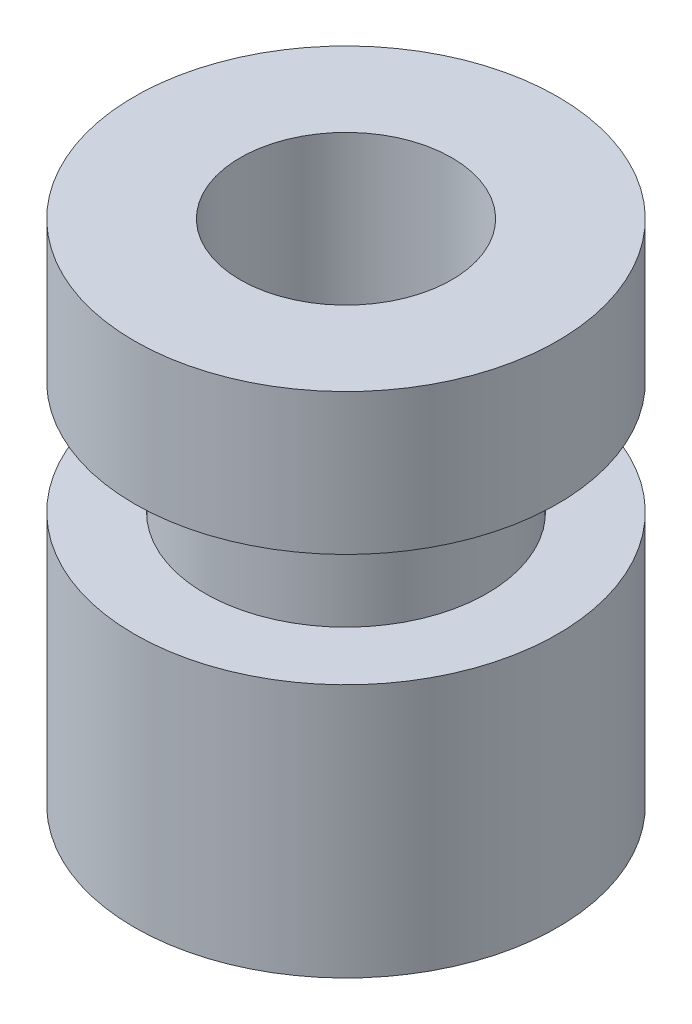
ISO-10303-21;
HEADER;
FILE_DESCRIPTION(('STEP AP214'),'2;1');
FILE_NAME('part.step','',(''),(''),'','','');
FILE_SCHEMA(('AUTOMOTIVE_DESIGN { 1 0 10303 214 1 1 1 1 }'));
ENDSEC;
DATA;
#1=APPLICATION_CONTEXT('core data for automotive mechanical design processes');
#2=APPLICATION_PROTOCOL_DEFINITION('international standard','automotive_design',2000,#1);
#3=PRODUCT_CONTEXT('',#1,'mechanical');
#4=PRODUCT('Part','Part','',(#3));
#5=PRODUCT_RELATED_PRODUCT_CATEGORY('part','',(#4));
#6=PRODUCT_DEFINITION_FORMATION('','',#4);
#7=PRODUCT_DEFINITION_CONTEXT('part definition',#1,'design');
#8=PRODUCT_DEFINITION('design','',#6,#7);
#9=PRODUCT_DEFINITION_SHAPE('','',#8);
#10=(LENGTH_UNIT() NAMED_UNIT(*) SI_UNIT(.MILLI.,.METRE.));
#11=(NAMED_UNIT(*) PLANE_ANGLE_UNIT() SI_UNIT($,.RADIAN.));
#12=(NAMED_UNIT(*) SI_UNIT($,.STERADIAN.) SOLID_ANGLE_UNIT());
#13=UNCERTAINTY_MEASURE_WITH_UNIT(LENGTH_MEASURE(1.E-05),#10,'distance_accuracy_value','');
#14=(GEOMETRIC_REPRESENTATION_CONTEXT(3) GLOBAL_UNCERTAINTY_ASSIGNED_CONTEXT((#13)) GLOBAL_UNIT_ASSIGNED_CONTEXT((#10,
#11,#12)) REPRESENTATION_CONTEXT('',''));
#15=CARTESIAN_POINT('',(0.,0.,0.));
#16=DIRECTION('',(0.,0.,1.));
#17=DIRECTION('',(1.,0.,0.));
#18=AXIS2_PLACEMENT_3D('',#15,#16,#17);
#19=CARTESIAN_POINT('',(0.,0.,0.));
#20=DIRECTION('',(0.,-1.,0.));
#21=DIRECTION('',(0.,0.,-1.));
#22=AXIS2_PLACEMENT_3D('',#19,#20,#21);
#23=CYLINDRICAL_SURFACE('',#22,1.5);
#24=CARTESIAN_POINT('',(0.,0.,0.));
#25=DIRECTION('',(0.,-1.,0.));
#26=DIRECTION('',(0.,0.,-1.));
#27=AXIS2_PLACEMENT_3D('',#24,#25,#26);
#28=CIRCLE('',#27,1.5);
#29=CARTESIAN_POINT('',(0.,0.,-1.5));
#30=VERTEX_POINT('',#29);
#31=EDGE_CURVE('E62',#30,#30,#28,.T.);
#32=ORIENTED_EDGE('',*,*,#31,.T.);
#33=EDGE_LOOP('',(#32));
#34=FACE_BOUND('',#33,.T.);
#35=CARTESIAN_POINT('',(0.,7.2,0.));
#36=DIRECTION('',(0.,-1.,0.));
#37=DIRECTION('',(0.,0.,-1.));
#38=AXIS2_PLACEMENT_3D('',#35,#36,#37);
#39=CIRCLE('',#38,1.5);
#40=CARTESIAN_POINT('',(0.,7.2,-1.5));
#41=VERTEX_POINT('',#40);
#42=EDGE_CURVE('E10',#41,#41,#39,.T.);
#43=ORIENTED_EDGE('',*,*,#42,.F.);
#44=EDGE_LOOP('',(#43));
#45=FACE_BOUND('',#44,.T.);
#46=ADVANCED_FACE('F34',(#34,#45),#23,.F.);
#47=CARTESIAN_POINT('',(1.5,7.2,0.));
#48=DIRECTION('',(0.,1.,0.));
#49=DIRECTION('',(0.,0.,1.));
#50=AXIS2_PLACEMENT_3D('',#47,#48,#49);
#51=PLANE('',#50);
#52=ORIENTED_EDGE('',*,*,#42,.T.);
#53=EDGE_LOOP('',(#52));
#54=FACE_BOUND('',#53,.T.);
#55=CARTESIAN_POINT('',(0.,7.2,0.));
#56=DIRECTION('',(0.,-1.,0.));
#57=DIRECTION('',(0.,0.,-1.));
#58=AXIS2_PLACEMENT_3D('',#55,#56,#57);
#59=CIRCLE('',#58,3.);
#60=CARTESIAN_POINT('',(0.,7.2,-3.));
#61=VERTEX_POINT('',#60);
#62=EDGE_CURVE('E40',#61,#61,#59,.T.);
#63=ORIENTED_EDGE('',*,*,#62,.F.);
#64=EDGE_LOOP('',(#63));
#65=FACE_BOUND('',#64,.T.);
#66=ADVANCED_FACE('F80',(#54,#65),#51,.T.);
#67=CARTESIAN_POINT('',(0.,0.,0.));
#68=DIRECTION('',(0.,-1.,0.));
#69=DIRECTION('',(0.,0.,-1.));
#70=AXIS2_PLACEMENT_3D('',#67,#68,#69);
#71=CYLINDRICAL_SURFACE('',#70,3.);
#72=ORIENTED_EDGE('',*,*,#62,.T.);
#73=EDGE_LOOP('',(#72));
#74=FACE_BOUND('',#73,.T.);
#75=CARTESIAN_POINT('',(0.,5.2,0.));
#76=DIRECTION('',(0.,-1.,0.));
#77=DIRECTION('',(0.,0.,-1.));
#78=AXIS2_PLACEMENT_3D('',#75,#76,#77);
#79=CIRCLE('',#78,3.);
#80=CARTESIAN_POINT('',(0.,5.2,-3.));
#81=VERTEX_POINT('',#80);
#82=EDGE_CURVE('E44',#81,#81,#79,.T.);
#83=ORIENTED_EDGE('',*,*,#82,.F.);
#84=EDGE_LOOP('',(#83));
#85=FACE_BOUND('',#84,.T.);
#86=ADVANCED_FACE('F84',(#74,#85),#71,.T.);
#87=CARTESIAN_POINT('',(3.,5.2,0.));
#88=DIRECTION('',(0.,-1.,0.));
#89=DIRECTION('',(0.,0.,-1.));
#90=AXIS2_PLACEMENT_3D('',#87,#88,#89);
#91=PLANE('',#90);
#92=ORIENTED_EDGE('',*,*,#82,.T.);
#93=EDGE_LOOP('',(#92));
#94=FACE_BOUND('',#93,.T.);
#95=CARTESIAN_POINT('',(0.,5.2,0.));
#96=DIRECTION('',(0.,-1.,0.));
#97=DIRECTION('',(0.,0.,-1.));
#98=AXIS2_PLACEMENT_3D('',#95,#96,#97);
#99=CIRCLE('',#98,2.);
#100=CARTESIAN_POINT('',(0.,5.2,-2.));
#101=VERTEX_POINT('',#100);
#102=EDGE_CURVE('E48',#101,#101,#99,.T.);
#103=ORIENTED_EDGE('',*,*,#102,.F.);
#104=EDGE_LOOP('',(#103));
#105=FACE_BOUND('',#104,.T.);
#106=ADVANCED_FACE('F88',(#94,#105),#91,.T.);
#107=CARTESIAN_POINT('',(0.,0.,0.));
#108=DIRECTION('',(0.,-1.,0.));
#109=DIRECTION('',(0.,0.,-1.));
#110=AXIS2_PLACEMENT_3D('',#107,#108,#109);
#111=CYLINDRICAL_SURFACE('',#110,2.);
#112=ORIENTED_EDGE('',*,*,#102,.T.);
#113=EDGE_LOOP('',(#112));
#114=FACE_BOUND('',#113,.T.);
#115=CARTESIAN_POINT('',(0.,3.6,0.));
#116=DIRECTION('',(0.,-1.,0.));
#117=DIRECTION('',(0.,0.,-1.));
#118=AXIS2_PLACEMENT_3D('',#115,#116,#117);
#119=CIRCLE('',#118,2.);
#120=CARTESIAN_POINT('',(0.,3.6,-2.));
#121=VERTEX_POINT('',#120);
#122=EDGE_CURVE('E53',#121,#121,#119,.T.);
#123=ORIENTED_EDGE('',*,*,#122,.F.);
#124=EDGE_LOOP('',(#123));
#125=FACE_BOUND('',#124,.T.);
#126=ADVANCED_FACE('F94',(#114,#125),#111,.T.);
#127=CARTESIAN_POINT('',(2.,3.6,0.));
#128=DIRECTION('',(0.,1.,0.));
#129=DIRECTION('',(0.,0.,1.));
#130=AXIS2_PLACEMENT_3D('',#127,#128,#129);
#131=PLANE('',#130);
#132=ORIENTED_EDGE('',*,*,#122,.T.);
#133=EDGE_LOOP('',(#132));
#134=FACE_BOUND('',#133,.T.);
#135=CARTESIAN_POINT('',(0.,3.6,0.));
#136=DIRECTION('',(0.,-1.,0.));
#137=DIRECTION('',(0.,0.,-1.));
#138=AXIS2_PLACEMENT_3D('',#135,#136,#137);
#139=CIRCLE('',#138,3.);
#140=CARTESIAN_POINT('',(0.,3.6,-3.));
#141=VERTEX_POINT('',#140);
#142=EDGE_CURVE('E56',#141,#141,#139,.T.);
#143=ORIENTED_EDGE('',*,*,#142,.F.);
#144=EDGE_LOOP('',(#143));
#145=FACE_BOUND('',#144,.T.);
#146=ADVANCED_FACE('F76',(#134,#145),#131,.T.);
#147=CARTESIAN_POINT('',(0.,0.,0.));
#148=DIRECTION('',(0.,-1.,0.));
#149=DIRECTION('',(0.,0.,-1.));
#150=AXIS2_PLACEMENT_3D('',#147,#148,#149);
#151=CYLINDRICAL_SURFACE('',#150,3.);
#152=ORIENTED_EDGE('',*,*,#142,.T.);
#153=EDGE_LOOP('',(#152));
#154=FACE_BOUND('',#153,.T.);
#155=CARTESIAN_POINT('',(0.,0.,0.));
#156=DIRECTION('',(0.,-1.,0.));
#157=DIRECTION('',(0.,0.,-1.));
#158=AXIS2_PLACEMENT_3D('',#155,#156,#157);
#159=CIRCLE('',#158,3.);
#160=CARTESIAN_POINT('',(0.,0.,-3.));
#161=VERTEX_POINT('',#160);
#162=EDGE_CURVE('E59',#161,#161,#159,.T.);
#163=ORIENTED_EDGE('',*,*,#162,.F.);
#164=EDGE_LOOP('',(#163));
#165=FACE_BOUND('',#164,.T.);
#166=ADVANCED_FACE('F70',(#154,#165),#151,.T.);
#167=CARTESIAN_POINT('',(3.,0.,0.));
#168=DIRECTION('',(0.,-1.,0.));
#169=DIRECTION('',(0.,0.,-1.));
#170=AXIS2_PLACEMENT_3D('',#167,#168,#169);
#171=PLANE('',#170);
#172=ORIENTED_EDGE('',*,*,#162,.T.);
#173=EDGE_LOOP('',(#172));
#174=FACE_BOUND('',#173,.T.);
#175=ORIENTED_EDGE('',*,*,#31,.F.);
#176=EDGE_LOOP('',(#175));
#177=FACE_BOUND('',#176,.T.);
#178=ADVANCED_FACE('F68',(#174,#177),#171,.T.);
#179=CLOSED_SHELL('',(#46,#66,#86,#106,#126,#146,#166,#178));
#180=MANIFOLD_SOLID_BREP('B2',#179);
#181=ADVANCED_BREP_SHAPE_REPRESENTATION('',(#18,#180),#14);
#182=SHAPE_DEFINITION_REPRESENTATION(#9,#181);
ENDSEC;
END-ISO-10303-21;
